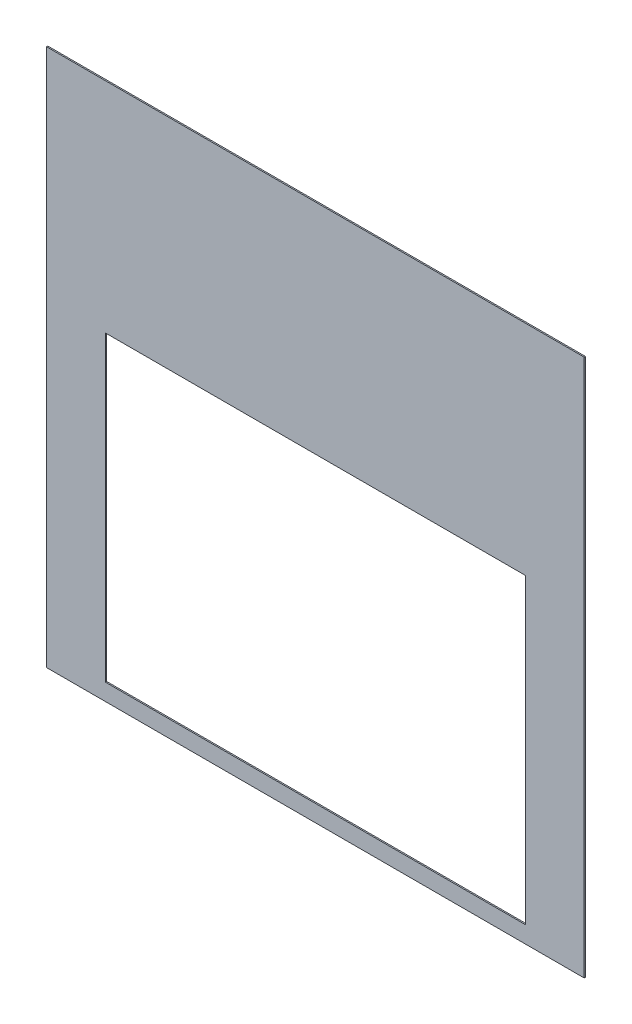
ISO-10303-21;
HEADER;
FILE_DESCRIPTION(('STEP AP214'),'2;1');
FILE_NAME('part.step','',(''),(''),'','','');
FILE_SCHEMA(('AUTOMOTIVE_DESIGN { 1 0 10303 214 1 1 1 1 }'));
ENDSEC;
DATA;
#1=APPLICATION_CONTEXT('core data for automotive mechanical design processes');
#2=APPLICATION_PROTOCOL_DEFINITION('international standard','automotive_design',2000,#1);
#3=PRODUCT_CONTEXT('',#1,'mechanical');
#4=PRODUCT('Part','Part','',(#3));
#5=PRODUCT_RELATED_PRODUCT_CATEGORY('part','',(#4));
#6=PRODUCT_DEFINITION_FORMATION('','',#4);
#7=PRODUCT_DEFINITION_CONTEXT('part definition',#1,'design');
#8=PRODUCT_DEFINITION('design','',#6,#7);
#9=PRODUCT_DEFINITION_SHAPE('','',#8);
#10=(LENGTH_UNIT() NAMED_UNIT(*) SI_UNIT(.MILLI.,.METRE.));
#11=(NAMED_UNIT(*) PLANE_ANGLE_UNIT() SI_UNIT($,.RADIAN.));
#12=(NAMED_UNIT(*) SI_UNIT($,.STERADIAN.) SOLID_ANGLE_UNIT());
#13=UNCERTAINTY_MEASURE_WITH_UNIT(LENGTH_MEASURE(1.E-05),#10,'distance_accuracy_value','');
#14=(GEOMETRIC_REPRESENTATION_CONTEXT(3) GLOBAL_UNCERTAINTY_ASSIGNED_CONTEXT((#13)) GLOBAL_UNIT_ASSIGNED_CONTEXT((#10,
#11,#12)) REPRESENTATION_CONTEXT('',''));
#15=CARTESIAN_POINT('',(0.,0.,0.));
#16=DIRECTION('',(0.,0.,1.));
#17=DIRECTION('',(1.,0.,0.));
#18=AXIS2_PLACEMENT_3D('',#15,#16,#17);
#19=CARTESIAN_POINT('',(0.,0.,40.));
#20=DIRECTION('',(0.,0.,-1.));
#21=DIRECTION('',(-1.,0.,0.));
#22=AXIS2_PLACEMENT_3D('',#19,#20,#21);
#23=PLANE('',#22);
#24=DIRECTION('',(0.,-1.,0.));
#25=VECTOR('',#24,1.);
#26=CARTESIAN_POINT('',(30.,700.,40.));
#27=LINE('',#26,#25);
#28=CARTESIAN_POINT('',(30.,1340.,40.));
#29=VERTEX_POINT('',#28);
#30=CARTESIAN_POINT('',(30.,700.,40.));
#31=VERTEX_POINT('',#30);
#32=EDGE_CURVE('E126',#29,#31,#27,.T.);
#33=ORIENTED_EDGE('',*,*,#32,.T.);
#34=DIRECTION('',(1.,0.,0.));
#35=VECTOR('',#34,1.);
#36=CARTESIAN_POINT('',(30.,700.,40.));
#37=LINE('',#36,#35);
#38=CARTESIAN_POINT('',(670.,700.,40.));
#39=VERTEX_POINT('',#38);
#40=EDGE_CURVE('E129',#31,#39,#37,.T.);
#41=ORIENTED_EDGE('',*,*,#40,.T.);
#42=DIRECTION('',(0.,1.,0.));
#43=VECTOR('',#42,1.);
#44=CARTESIAN_POINT('',(670.,700.,40.));
#45=LINE('',#44,#43);
#46=CARTESIAN_POINT('',(670.,1340.,40.));
#47=VERTEX_POINT('',#46);
#48=EDGE_CURVE('E132',#39,#47,#45,.T.);
#49=ORIENTED_EDGE('',*,*,#48,.T.);
#50=DIRECTION('',(-1.,0.,0.));
#51=VECTOR('',#50,1.);
#52=CARTESIAN_POINT('',(30.,1340.,40.));
#53=LINE('',#52,#51);
#54=EDGE_CURVE('E134',#47,#29,#53,.T.);
#55=ORIENTED_EDGE('',*,*,#54,.T.);
#56=EDGE_LOOP('',(#33,#41,#49,#55));
#57=FACE_BOUND('',#56,.T.);
#58=DIRECTION('',(0.,-1.,0.));
#59=VECTOR('',#58,1.);
#60=CARTESIAN_POINT('',(100.,0.,40.));
#61=LINE('',#60,#59);
#62=CARTESIAN_POINT('',(100.,1080.,40.));
#63=VERTEX_POINT('',#62);
#64=CARTESIAN_POINT('',(100.,720.,40.));
#65=VERTEX_POINT('',#64);
#66=EDGE_CURVE('E112',#63,#65,#61,.T.);
#67=ORIENTED_EDGE('',*,*,#66,.F.);
#68=DIRECTION('',(-1.,0.,0.));
#69=VECTOR('',#68,1.);
#70=CARTESIAN_POINT('',(0.,1080.,40.));
#71=LINE('',#70,#69);
#72=CARTESIAN_POINT('',(600.,1080.,40.));
#73=VERTEX_POINT('',#72);
#74=EDGE_CURVE('E101',#73,#63,#71,.T.);
#75=ORIENTED_EDGE('',*,*,#74,.F.);
#76=DIRECTION('',(0.,1.,0.));
#77=VECTOR('',#76,1.);
#78=CARTESIAN_POINT('',(600.,0.,40.));
#79=LINE('',#78,#77);
#80=CARTESIAN_POINT('',(600.,720.,40.));
#81=VERTEX_POINT('',#80);
#82=EDGE_CURVE('E106',#81,#73,#79,.T.);
#83=ORIENTED_EDGE('',*,*,#82,.F.);
#84=DIRECTION('',(1.,0.,0.));
#85=VECTOR('',#84,1.);
#86=CARTESIAN_POINT('',(0.,720.,40.));
#87=LINE('',#86,#85);
#88=EDGE_CURVE('E117',#65,#81,#87,.T.);
#89=ORIENTED_EDGE('',*,*,#88,.F.);
#90=EDGE_LOOP('',(#67,#75,#83,#89));
#91=FACE_BOUND('',#90,.T.);
#92=ADVANCED_FACE('F39',(#57,#91),#23,.F.);
#93=CARTESIAN_POINT('',(0.,0.,38.5));
#94=DIRECTION('',(0.,0.,-1.));
#95=DIRECTION('',(-1.,0.,0.));
#96=AXIS2_PLACEMENT_3D('',#93,#94,#95);
#97=PLANE('',#96);
#98=DIRECTION('',(0.,-1.,0.));
#99=VECTOR('',#98,1.);
#100=CARTESIAN_POINT('',(30.,700.,38.5));
#101=LINE('',#100,#99);
#102=CARTESIAN_POINT('',(30.,1340.,38.5));
#103=VERTEX_POINT('',#102);
#104=CARTESIAN_POINT('',(30.,700.,38.5));
#105=VERTEX_POINT('',#104);
#106=EDGE_CURVE('E118',#103,#105,#101,.T.);
#107=ORIENTED_EDGE('',*,*,#106,.F.);
#108=DIRECTION('',(-1.,0.,0.));
#109=VECTOR('',#108,1.);
#110=CARTESIAN_POINT('',(30.,1340.,38.5));
#111=LINE('',#110,#109);
#112=CARTESIAN_POINT('',(670.,1340.,38.5));
#113=VERTEX_POINT('',#112);
#114=EDGE_CURVE('E130',#113,#103,#111,.T.);
#115=ORIENTED_EDGE('',*,*,#114,.F.);
#116=DIRECTION('',(0.,1.,0.));
#117=VECTOR('',#116,1.);
#118=CARTESIAN_POINT('',(670.,700.,38.5));
#119=LINE('',#118,#117);
#120=CARTESIAN_POINT('',(670.,700.,38.5));
#121=VERTEX_POINT('',#120);
#122=EDGE_CURVE('E138',#121,#113,#119,.T.);
#123=ORIENTED_EDGE('',*,*,#122,.F.);
#124=DIRECTION('',(1.,0.,0.));
#125=VECTOR('',#124,1.);
#126=CARTESIAN_POINT('',(30.,700.,38.5));
#127=LINE('',#126,#125);
#128=EDGE_CURVE('E121',#105,#121,#127,.T.);
#129=ORIENTED_EDGE('',*,*,#128,.F.);
#130=EDGE_LOOP('',(#107,#115,#123,#129));
#131=FACE_BOUND('',#130,.T.);
#132=DIRECTION('',(-1.,0.,0.));
#133=VECTOR('',#132,1.);
#134=CARTESIAN_POINT('',(0.,1080.,38.5));
#135=LINE('',#134,#133);
#136=CARTESIAN_POINT('',(600.,1080.,38.5));
#137=VERTEX_POINT('',#136);
#138=CARTESIAN_POINT('',(100.,1080.,38.5));
#139=VERTEX_POINT('',#138);
#140=EDGE_CURVE('E152',#137,#139,#135,.T.);
#141=ORIENTED_EDGE('',*,*,#140,.T.);
#142=DIRECTION('',(0.,-1.,0.));
#143=VECTOR('',#142,1.);
#144=CARTESIAN_POINT('',(100.,0.,38.5));
#145=LINE('',#144,#143);
#146=CARTESIAN_POINT('',(100.,720.,38.5));
#147=VERTEX_POINT('',#146);
#148=EDGE_CURVE('E11',#139,#147,#145,.T.);
#149=ORIENTED_EDGE('',*,*,#148,.T.);
#150=DIRECTION('',(1.,0.,0.));
#151=VECTOR('',#150,1.);
#152=CARTESIAN_POINT('',(0.,720.,38.5));
#153=LINE('',#152,#151);
#154=CARTESIAN_POINT('',(600.,720.,38.5));
#155=VERTEX_POINT('',#154);
#156=EDGE_CURVE('E47',#147,#155,#153,.T.);
#157=ORIENTED_EDGE('',*,*,#156,.T.);
#158=DIRECTION('',(0.,1.,0.));
#159=VECTOR('',#158,1.);
#160=CARTESIAN_POINT('',(600.,0.,38.5));
#161=LINE('',#160,#159);
#162=EDGE_CURVE('E154',#155,#137,#161,.T.);
#163=ORIENTED_EDGE('',*,*,#162,.T.);
#164=EDGE_LOOP('',(#141,#149,#157,#163));
#165=FACE_BOUND('',#164,.T.);
#166=ADVANCED_FACE('F158',(#131,#165),#97,.T.);
#167=CARTESIAN_POINT('',(30.,700.,40.));
#168=DIRECTION('',(1.,0.,0.));
#169=DIRECTION('',(0.,0.,-1.));
#170=AXIS2_PLACEMENT_3D('',#167,#168,#169);
#171=PLANE('',#170);
#172=ORIENTED_EDGE('',*,*,#106,.T.);
#173=DIRECTION('',(0.,0.,-1.));
#174=VECTOR('',#173,1.);
#175=CARTESIAN_POINT('',(30.,700.,40.));
#176=LINE('',#175,#174);
#177=EDGE_CURVE('E149',#31,#105,#176,.T.);
#178=ORIENTED_EDGE('',*,*,#177,.F.);
#179=ORIENTED_EDGE('',*,*,#32,.F.);
#180=DIRECTION('',(0.,0.,-1.));
#181=VECTOR('',#180,1.);
#182=CARTESIAN_POINT('',(30.,1340.,40.));
#183=LINE('',#182,#181);
#184=EDGE_CURVE('E135',#29,#103,#183,.T.);
#185=ORIENTED_EDGE('',*,*,#184,.T.);
#186=EDGE_LOOP('',(#172,#178,#179,#185));
#187=FACE_BOUND('',#186,.T.);
#188=ADVANCED_FACE('F41',(#187),#171,.F.);
#189=CARTESIAN_POINT('',(30.,700.,40.));
#190=DIRECTION('',(0.,1.,0.));
#191=DIRECTION('',(0.,0.,1.));
#192=AXIS2_PLACEMENT_3D('',#189,#190,#191);
#193=PLANE('',#192);
#194=ORIENTED_EDGE('',*,*,#128,.T.);
#195=DIRECTION('',(0.,0.,-1.));
#196=VECTOR('',#195,1.);
#197=CARTESIAN_POINT('',(670.,700.,40.));
#198=LINE('',#197,#196);
#199=EDGE_CURVE('E146',#39,#121,#198,.T.);
#200=ORIENTED_EDGE('',*,*,#199,.F.);
#201=ORIENTED_EDGE('',*,*,#40,.F.);
#202=ORIENTED_EDGE('',*,*,#177,.T.);
#203=EDGE_LOOP('',(#194,#200,#201,#202));
#204=FACE_BOUND('',#203,.T.);
#205=ADVANCED_FACE('F193',(#204),#193,.F.);
#206=CARTESIAN_POINT('',(670.,700.,40.));
#207=DIRECTION('',(-1.,0.,0.));
#208=DIRECTION('',(0.,0.,1.));
#209=AXIS2_PLACEMENT_3D('',#206,#207,#208);
#210=PLANE('',#209);
#211=ORIENTED_EDGE('',*,*,#122,.T.);
#212=DIRECTION('',(0.,0.,-1.));
#213=VECTOR('',#212,1.);
#214=CARTESIAN_POINT('',(670.,1340.,40.));
#215=LINE('',#214,#213);
#216=EDGE_CURVE('E143',#47,#113,#215,.T.);
#217=ORIENTED_EDGE('',*,*,#216,.F.);
#218=ORIENTED_EDGE('',*,*,#48,.F.);
#219=ORIENTED_EDGE('',*,*,#199,.T.);
#220=EDGE_LOOP('',(#211,#217,#218,#219));
#221=FACE_BOUND('',#220,.T.);
#222=ADVANCED_FACE('F190',(#221),#210,.F.);
#223=CARTESIAN_POINT('',(30.,1340.,40.));
#224=DIRECTION('',(0.,-1.,0.));
#225=DIRECTION('',(0.,0.,-1.));
#226=AXIS2_PLACEMENT_3D('',#223,#224,#225);
#227=PLANE('',#226);
#228=ORIENTED_EDGE('',*,*,#114,.T.);
#229=ORIENTED_EDGE('',*,*,#184,.F.);
#230=ORIENTED_EDGE('',*,*,#54,.F.);
#231=ORIENTED_EDGE('',*,*,#216,.T.);
#232=EDGE_LOOP('',(#228,#229,#230,#231));
#233=FACE_BOUND('',#232,.T.);
#234=ADVANCED_FACE('F188',(#233),#227,.F.);
#235=CARTESIAN_POINT('',(100.,720.,41.));
#236=DIRECTION('',(1.,0.,0.));
#237=DIRECTION('',(0.,0.,-1.));
#238=AXIS2_PLACEMENT_3D('',#235,#236,#237);
#239=PLANE('',#238);
#240=ORIENTED_EDGE('',*,*,#66,.T.);
#241=DIRECTION('',(0.,0.,-1.));
#242=VECTOR('',#241,1.);
#243=CARTESIAN_POINT('',(100.,720.,41.));
#244=LINE('',#243,#242);
#245=EDGE_CURVE('E107',#65,#147,#244,.T.);
#246=ORIENTED_EDGE('',*,*,#245,.T.);
#247=ORIENTED_EDGE('',*,*,#148,.F.);
#248=DIRECTION('',(0.,0.,-1.));
#249=VECTOR('',#248,1.);
#250=CARTESIAN_POINT('',(100.,1080.,41.));
#251=LINE('',#250,#249);
#252=EDGE_CURVE('E59',#63,#139,#251,.T.);
#253=ORIENTED_EDGE('',*,*,#252,.F.);
#254=EDGE_LOOP('',(#240,#246,#247,#253));
#255=FACE_BOUND('',#254,.T.);
#256=ADVANCED_FACE('F110',(#255),#239,.T.);
#257=CARTESIAN_POINT('',(100.,720.,41.));
#258=DIRECTION('',(0.,1.,0.));
#259=DIRECTION('',(0.,0.,1.));
#260=AXIS2_PLACEMENT_3D('',#257,#258,#259);
#261=PLANE('',#260);
#262=ORIENTED_EDGE('',*,*,#88,.T.);
#263=DIRECTION('',(0.,0.,-1.));
#264=VECTOR('',#263,1.);
#265=CARTESIAN_POINT('',(600.,720.,41.));
#266=LINE('',#265,#264);
#267=EDGE_CURVE('E163',#81,#155,#266,.T.);
#268=ORIENTED_EDGE('',*,*,#267,.T.);
#269=ORIENTED_EDGE('',*,*,#156,.F.);
#270=ORIENTED_EDGE('',*,*,#245,.F.);
#271=EDGE_LOOP('',(#262,#268,#269,#270));
#272=FACE_BOUND('',#271,.T.);
#273=ADVANCED_FACE('F161',(#272),#261,.T.);
#274=CARTESIAN_POINT('',(600.,720.,41.));
#275=DIRECTION('',(-1.,0.,0.));
#276=DIRECTION('',(0.,0.,1.));
#277=AXIS2_PLACEMENT_3D('',#274,#275,#276);
#278=PLANE('',#277);
#279=ORIENTED_EDGE('',*,*,#82,.T.);
#280=DIRECTION('',(0.,0.,-1.));
#281=VECTOR('',#280,1.);
#282=CARTESIAN_POINT('',(600.,1080.,41.));
#283=LINE('',#282,#281);
#284=EDGE_CURVE('E54',#73,#137,#283,.T.);
#285=ORIENTED_EDGE('',*,*,#284,.T.);
#286=ORIENTED_EDGE('',*,*,#162,.F.);
#287=ORIENTED_EDGE('',*,*,#267,.F.);
#288=EDGE_LOOP('',(#279,#285,#286,#287));
#289=FACE_BOUND('',#288,.T.);
#290=ADVANCED_FACE('F168',(#289),#278,.T.);
#291=CARTESIAN_POINT('',(100.,1080.,41.));
#292=DIRECTION('',(0.,-1.,0.));
#293=DIRECTION('',(0.,0.,-1.));
#294=AXIS2_PLACEMENT_3D('',#291,#292,#293);
#295=PLANE('',#294);
#296=ORIENTED_EDGE('',*,*,#74,.T.);
#297=ORIENTED_EDGE('',*,*,#252,.T.);
#298=ORIENTED_EDGE('',*,*,#140,.F.);
#299=ORIENTED_EDGE('',*,*,#284,.F.);
#300=EDGE_LOOP('',(#296,#297,#298,#299));
#301=FACE_BOUND('',#300,.T.);
#302=ADVANCED_FACE('F102',(#301),#295,.T.);
#303=CLOSED_SHELL('',(#92,#166,#188,#205,#222,#234,#256,#273,#290,#302));
#304=MANIFOLD_SOLID_BREP('B2',#303);
#305=ADVANCED_BREP_SHAPE_REPRESENTATION('',(#18,#304),#14);
#306=SHAPE_DEFINITION_REPRESENTATION(#9,#305);
ENDSEC;
END-ISO-10303-21;
